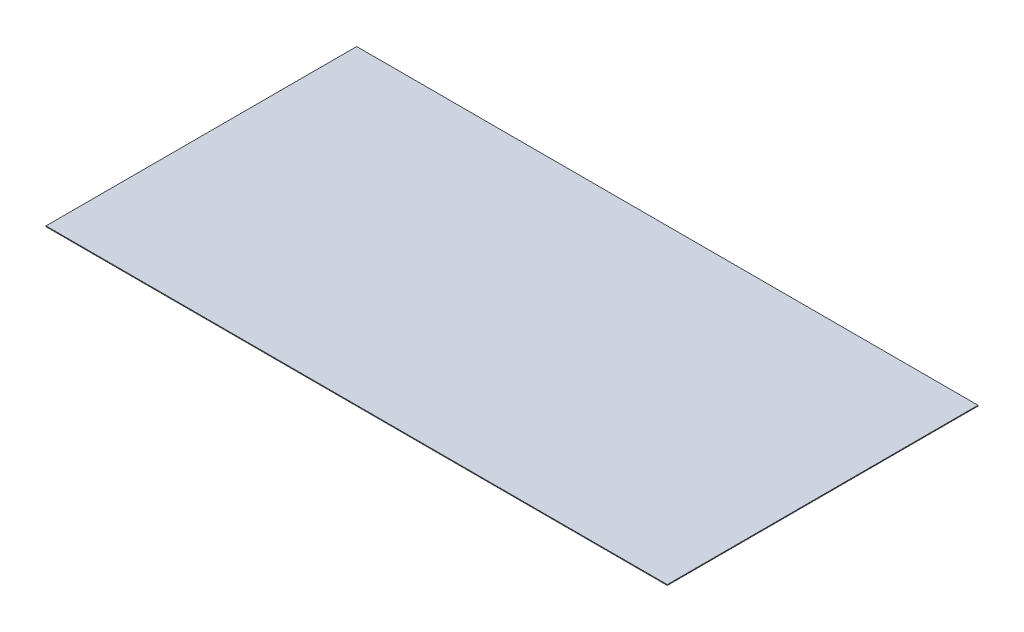
ISO-10303-21;
HEADER;
FILE_DESCRIPTION(('STEP AP214'),'2;1');
FILE_NAME('part.step','',(''),(''),'','','');
FILE_SCHEMA(('AUTOMOTIVE_DESIGN { 1 0 10303 214 1 1 1 1 }'));
ENDSEC;
DATA;
#1=APPLICATION_CONTEXT('core data for automotive mechanical design processes');
#2=APPLICATION_PROTOCOL_DEFINITION('international standard','automotive_design',2000,#1);
#3=PRODUCT_CONTEXT('',#1,'mechanical');
#4=PRODUCT('Part','Part','',(#3));
#5=PRODUCT_RELATED_PRODUCT_CATEGORY('part','',(#4));
#6=PRODUCT_DEFINITION_FORMATION('','',#4);
#7=PRODUCT_DEFINITION_CONTEXT('part definition',#1,'design');
#8=PRODUCT_DEFINITION('design','',#6,#7);
#9=PRODUCT_DEFINITION_SHAPE('','',#8);
#10=(LENGTH_UNIT() NAMED_UNIT(*) SI_UNIT(.MILLI.,.METRE.));
#11=(NAMED_UNIT(*) PLANE_ANGLE_UNIT() SI_UNIT($,.RADIAN.));
#12=(NAMED_UNIT(*) SI_UNIT($,.STERADIAN.) SOLID_ANGLE_UNIT());
#13=UNCERTAINTY_MEASURE_WITH_UNIT(LENGTH_MEASURE(1.E-05),#10,'distance_accuracy_value','');
#14=(GEOMETRIC_REPRESENTATION_CONTEXT(3) GLOBAL_UNCERTAINTY_ASSIGNED_CONTEXT((#13)) GLOBAL_UNIT_ASSIGNED_CONTEXT((#10,
#11,#12)) REPRESENTATION_CONTEXT('',''));
#15=CARTESIAN_POINT('',(0.,0.,0.));
#16=DIRECTION('',(0.,0.,1.));
#17=DIRECTION('',(1.,0.,0.));
#18=AXIS2_PLACEMENT_3D('',#15,#16,#17);
#19=CARTESIAN_POINT('',(1220.,3.,-610.));
#20=DIRECTION('',(-1.,0.,0.));
#21=DIRECTION('',(0.,0.,1.));
#22=AXIS2_PLACEMENT_3D('',#19,#20,#21);
#23=PLANE('',#22);
#24=DIRECTION('',(0.,0.,-1.));
#25=VECTOR('',#24,1.);
#26=CARTESIAN_POINT('',(1220.,0.,-610.));
#27=LINE('',#26,#25);
#28=CARTESIAN_POINT('',(1220.,0.,610.));
#29=VERTEX_POINT('',#28);
#30=CARTESIAN_POINT('',(1220.,0.,-610.));
#31=VERTEX_POINT('',#30);
#32=EDGE_CURVE('E102',#29,#31,#27,.T.);
#33=ORIENTED_EDGE('',*,*,#32,.T.);
#34=DIRECTION('',(0.,-1.,0.));
#35=VECTOR('',#34,1.);
#36=CARTESIAN_POINT('',(1220.,3.,-610.));
#37=LINE('',#36,#35);
#38=CARTESIAN_POINT('',(1220.,3.,-610.));
#39=VERTEX_POINT('',#38);
#40=EDGE_CURVE('E11',#39,#31,#37,.T.);
#41=ORIENTED_EDGE('',*,*,#40,.F.);
#42=DIRECTION('',(0.,0.,-1.));
#43=VECTOR('',#42,1.);
#44=CARTESIAN_POINT('',(1220.,3.,-610.));
#45=LINE('',#44,#43);
#46=CARTESIAN_POINT('',(1220.,3.,610.));
#47=VERTEX_POINT('',#46);
#48=EDGE_CURVE('E90',#47,#39,#45,.T.);
#49=ORIENTED_EDGE('',*,*,#48,.F.);
#50=DIRECTION('',(0.,-1.,0.));
#51=VECTOR('',#50,1.);
#52=CARTESIAN_POINT('',(1220.,3.,610.));
#53=LINE('',#52,#51);
#54=EDGE_CURVE('E98',#47,#29,#53,.T.);
#55=ORIENTED_EDGE('',*,*,#54,.T.);
#56=EDGE_LOOP('',(#33,#41,#49,#55));
#57=FACE_BOUND('',#56,.T.);
#58=ADVANCED_FACE('F39',(#57),#23,.F.);
#59=CARTESIAN_POINT('',(-1220.,3.,-610.));
#60=DIRECTION('',(0.,0.,1.));
#61=DIRECTION('',(1.,0.,0.));
#62=AXIS2_PLACEMENT_3D('',#59,#60,#61);
#63=PLANE('',#62);
#64=DIRECTION('',(-1.,0.,0.));
#65=VECTOR('',#64,1.);
#66=CARTESIAN_POINT('',(-1220.,0.,-610.));
#67=LINE('',#66,#65);
#68=CARTESIAN_POINT('',(-1220.,0.,-610.));
#69=VERTEX_POINT('',#68);
#70=EDGE_CURVE('E94',#31,#69,#67,.T.);
#71=ORIENTED_EDGE('',*,*,#70,.T.);
#72=DIRECTION('',(0.,-1.,0.));
#73=VECTOR('',#72,1.);
#74=CARTESIAN_POINT('',(-1220.,3.,-610.));
#75=LINE('',#74,#73);
#76=CARTESIAN_POINT('',(-1220.,3.,-610.));
#77=VERTEX_POINT('',#76);
#78=EDGE_CURVE('E47',#77,#69,#75,.T.);
#79=ORIENTED_EDGE('',*,*,#78,.F.);
#80=DIRECTION('',(-1.,0.,0.));
#81=VECTOR('',#80,1.);
#82=CARTESIAN_POINT('',(-1220.,3.,-610.));
#83=LINE('',#82,#81);
#84=EDGE_CURVE('E85',#39,#77,#83,.T.);
#85=ORIENTED_EDGE('',*,*,#84,.F.);
#86=ORIENTED_EDGE('',*,*,#40,.T.);
#87=EDGE_LOOP('',(#71,#79,#85,#86));
#88=FACE_BOUND('',#87,.T.);
#89=ADVANCED_FACE('F93',(#88),#63,.F.);
#90=CARTESIAN_POINT('',(-1220.,3.,-610.));
#91=DIRECTION('',(1.,0.,0.));
#92=DIRECTION('',(0.,0.,-1.));
#93=AXIS2_PLACEMENT_3D('',#90,#91,#92);
#94=PLANE('',#93);
#95=DIRECTION('',(0.,0.,1.));
#96=VECTOR('',#95,1.);
#97=CARTESIAN_POINT('',(-1220.,0.,-610.));
#98=LINE('',#97,#96);
#99=CARTESIAN_POINT('',(-1220.,0.,610.));
#100=VERTEX_POINT('',#99);
#101=EDGE_CURVE('E72',#69,#100,#98,.T.);
#102=ORIENTED_EDGE('',*,*,#101,.T.);
#103=DIRECTION('',(0.,-1.,0.));
#104=VECTOR('',#103,1.);
#105=CARTESIAN_POINT('',(-1220.,3.,610.));
#106=LINE('',#105,#104);
#107=CARTESIAN_POINT('',(-1220.,3.,610.));
#108=VERTEX_POINT('',#107);
#109=EDGE_CURVE('E95',#108,#100,#106,.T.);
#110=ORIENTED_EDGE('',*,*,#109,.F.);
#111=DIRECTION('',(0.,0.,1.));
#112=VECTOR('',#111,1.);
#113=CARTESIAN_POINT('',(-1220.,3.,-610.));
#114=LINE('',#113,#112);
#115=EDGE_CURVE('E88',#77,#108,#114,.T.);
#116=ORIENTED_EDGE('',*,*,#115,.F.);
#117=ORIENTED_EDGE('',*,*,#78,.T.);
#118=EDGE_LOOP('',(#102,#110,#116,#117));
#119=FACE_BOUND('',#118,.T.);
#120=ADVANCED_FACE('F96',(#119),#94,.F.);
#121=CARTESIAN_POINT('',(-1220.,3.,610.));
#122=DIRECTION('',(0.,0.,-1.));
#123=DIRECTION('',(-1.,0.,0.));
#124=AXIS2_PLACEMENT_3D('',#121,#122,#123);
#125=PLANE('',#124);
#126=DIRECTION('',(1.,0.,0.));
#127=VECTOR('',#126,1.);
#128=CARTESIAN_POINT('',(-1220.,0.,610.));
#129=LINE('',#128,#127);
#130=EDGE_CURVE('E78',#100,#29,#129,.T.);
#131=ORIENTED_EDGE('',*,*,#130,.T.);
#132=ORIENTED_EDGE('',*,*,#54,.F.);
#133=DIRECTION('',(1.,0.,0.));
#134=VECTOR('',#133,1.);
#135=CARTESIAN_POINT('',(-1220.,3.,610.));
#136=LINE('',#135,#134);
#137=EDGE_CURVE('E55',#108,#47,#136,.T.);
#138=ORIENTED_EDGE('',*,*,#137,.F.);
#139=ORIENTED_EDGE('',*,*,#109,.T.);
#140=EDGE_LOOP('',(#131,#132,#138,#139));
#141=FACE_BOUND('',#140,.T.);
#142=ADVANCED_FACE('F109',(#141),#125,.F.);
#143=CARTESIAN_POINT('',(0.,3.,0.));
#144=DIRECTION('',(0.,1.,0.));
#145=DIRECTION('',(0.,0.,1.));
#146=AXIS2_PLACEMENT_3D('',#143,#144,#145);
#147=PLANE('',#146);
#148=ORIENTED_EDGE('',*,*,#48,.T.);
#149=ORIENTED_EDGE('',*,*,#84,.T.);
#150=ORIENTED_EDGE('',*,*,#115,.T.);
#151=ORIENTED_EDGE('',*,*,#137,.T.);
#152=EDGE_LOOP('',(#148,#149,#150,#151));
#153=FACE_BOUND('',#152,.T.);
#154=ADVANCED_FACE('F86',(#153),#147,.T.);
#155=CARTESIAN_POINT('',(0.,0.,0.));
#156=DIRECTION('',(0.,1.,0.));
#157=DIRECTION('',(0.,0.,1.));
#158=AXIS2_PLACEMENT_3D('',#155,#156,#157);
#159=PLANE('',#158);
#160=ORIENTED_EDGE('',*,*,#32,.F.);
#161=ORIENTED_EDGE('',*,*,#130,.F.);
#162=ORIENTED_EDGE('',*,*,#101,.F.);
#163=ORIENTED_EDGE('',*,*,#70,.F.);
#164=EDGE_LOOP('',(#160,#161,#162,#163));
#165=FACE_BOUND('',#164,.T.);
#166=ADVANCED_FACE('F112',(#165),#159,.F.);
#167=CLOSED_SHELL('',(#58,#89,#120,#142,#154,#166));
#168=MANIFOLD_SOLID_BREP('B2',#167);
#169=ADVANCED_BREP_SHAPE_REPRESENTATION('',(#18,#168),#14);
#170=SHAPE_DEFINITION_REPRESENTATION(#9,#169);
ENDSEC;
END-ISO-10303-21;
